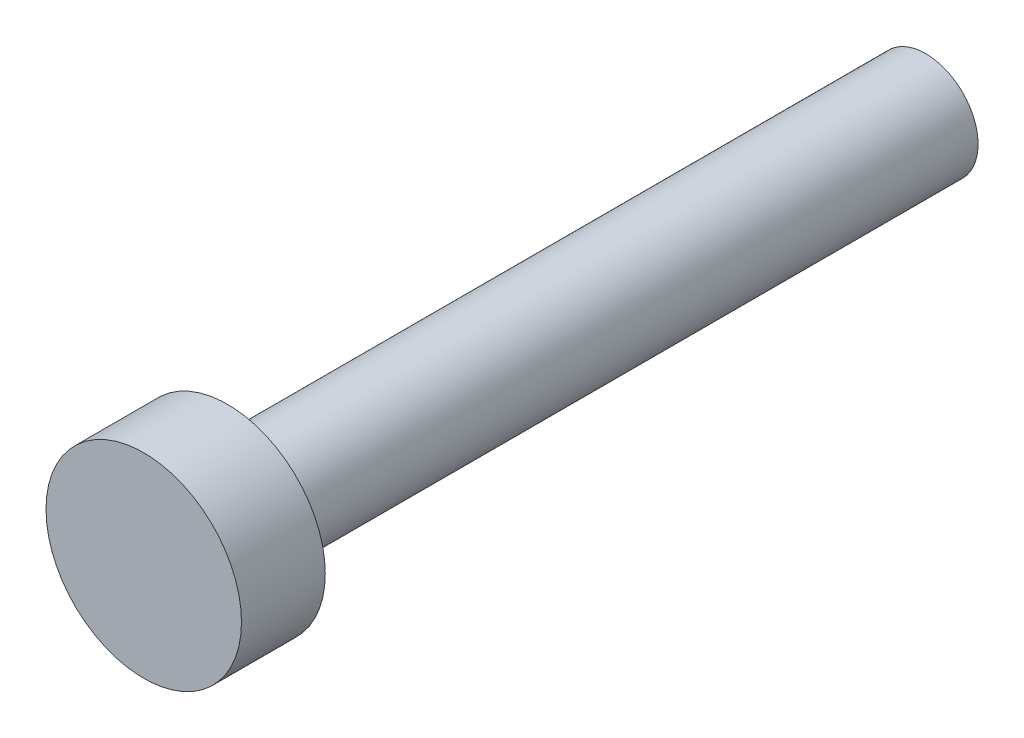
ISO-10303-21;
HEADER;
FILE_DESCRIPTION(('STEP AP214'),'2;1');
FILE_NAME('part.step','',(''),(''),'','','');
FILE_SCHEMA(('AUTOMOTIVE_DESIGN { 1 0 10303 214 1 1 1 1 }'));
ENDSEC;
DATA;
#1=APPLICATION_CONTEXT('core data for automotive mechanical design processes');
#2=APPLICATION_PROTOCOL_DEFINITION('international standard','automotive_design',2000,#1);
#3=PRODUCT_CONTEXT('',#1,'mechanical');
#4=PRODUCT('Part','Part','',(#3));
#5=PRODUCT_RELATED_PRODUCT_CATEGORY('part','',(#4));
#6=PRODUCT_DEFINITION_FORMATION('','',#4);
#7=PRODUCT_DEFINITION_CONTEXT('part definition',#1,'design');
#8=PRODUCT_DEFINITION('design','',#6,#7);
#9=PRODUCT_DEFINITION_SHAPE('','',#8);
#10=(LENGTH_UNIT() NAMED_UNIT(*) SI_UNIT(.MILLI.,.METRE.));
#11=(NAMED_UNIT(*) PLANE_ANGLE_UNIT() SI_UNIT($,.RADIAN.));
#12=(NAMED_UNIT(*) SI_UNIT($,.STERADIAN.) SOLID_ANGLE_UNIT());
#13=UNCERTAINTY_MEASURE_WITH_UNIT(LENGTH_MEASURE(1.E-05),#10,'distance_accuracy_value','');
#14=(GEOMETRIC_REPRESENTATION_CONTEXT(3) GLOBAL_UNCERTAINTY_ASSIGNED_CONTEXT((#13)) GLOBAL_UNIT_ASSIGNED_CONTEXT((#10,
#11,#12)) REPRESENTATION_CONTEXT('',''));
#15=CARTESIAN_POINT('',(0.,0.,0.));
#16=DIRECTION('',(0.,0.,1.));
#17=DIRECTION('',(1.,0.,0.));
#18=AXIS2_PLACEMENT_3D('',#15,#16,#17);
#19=CARTESIAN_POINT('',(0.,0.,2.4));
#20=DIRECTION('',(0.,0.,-1.));
#21=DIRECTION('',(-1.,0.,0.));
#22=AXIS2_PLACEMENT_3D('',#19,#20,#21);
#23=CYLINDRICAL_SURFACE('',#22,2.8);
#24=CARTESIAN_POINT('',(0.,0.,2.4));
#25=DIRECTION('',(0.,0.,1.));
#26=DIRECTION('',(1.,0.,0.));
#27=AXIS2_PLACEMENT_3D('',#24,#25,#26);
#28=CIRCLE('',#27,2.8);
#29=CARTESIAN_POINT('',(2.8,0.,2.4));
#30=VERTEX_POINT('',#29);
#31=EDGE_CURVE('E38',#30,#30,#28,.T.);
#32=ORIENTED_EDGE('',*,*,#31,.F.);
#33=EDGE_LOOP('',(#32));
#34=FACE_BOUND('',#33,.T.);
#35=CARTESIAN_POINT('',(0.,0.,0.));
#36=DIRECTION('',(0.,0.,1.));
#37=DIRECTION('',(1.,0.,0.));
#38=AXIS2_PLACEMENT_3D('',#35,#36,#37);
#39=CIRCLE('',#38,2.8);
#40=CARTESIAN_POINT('',(2.8,0.,0.));
#41=VERTEX_POINT('',#40);
#42=EDGE_CURVE('E34',#41,#41,#39,.T.);
#43=ORIENTED_EDGE('',*,*,#42,.T.);
#44=EDGE_LOOP('',(#43));
#45=FACE_BOUND('',#44,.T.);
#46=ADVANCED_FACE('F31',(#34,#45),#23,.T.);
#47=CARTESIAN_POINT('',(0.,0.,2.4));
#48=DIRECTION('',(0.,0.,1.));
#49=DIRECTION('',(1.,0.,0.));
#50=AXIS2_PLACEMENT_3D('',#47,#48,#49);
#51=PLANE('',#50);
#52=ORIENTED_EDGE('',*,*,#31,.T.);
#53=EDGE_LOOP('',(#52));
#54=FACE_BOUND('',#53,.T.);
#55=ADVANCED_FACE('F55',(#54),#51,.T.);
#56=CARTESIAN_POINT('',(0.,0.,0.));
#57=DIRECTION('',(0.,0.,1.));
#58=DIRECTION('',(1.,0.,0.));
#59=AXIS2_PLACEMENT_3D('',#56,#57,#58);
#60=PLANE('',#59);
#61=CARTESIAN_POINT('',(0.,0.,0.));
#62=DIRECTION('',(0.,0.,-1.));
#63=DIRECTION('',(-1.,0.,0.));
#64=AXIS2_PLACEMENT_3D('',#61,#62,#63);
#65=CIRCLE('',#64,1.5);
#66=CARTESIAN_POINT('',(-1.5,0.,0.));
#67=VERTEX_POINT('',#66);
#68=EDGE_CURVE('E10',#67,#67,#65,.T.);
#69=ORIENTED_EDGE('',*,*,#68,.F.);
#70=EDGE_LOOP('',(#69));
#71=FACE_BOUND('',#70,.T.);
#72=ORIENTED_EDGE('',*,*,#42,.F.);
#73=EDGE_LOOP('',(#72));
#74=FACE_BOUND('',#73,.T.);
#75=ADVANCED_FACE('F52',(#71,#74),#60,.F.);
#76=CARTESIAN_POINT('',(0.,0.,-20.));
#77=DIRECTION('',(0.,0.,1.));
#78=DIRECTION('',(1.,0.,0.));
#79=AXIS2_PLACEMENT_3D('',#76,#77,#78);
#80=CYLINDRICAL_SURFACE('',#79,1.5);
#81=CARTESIAN_POINT('',(0.,0.,-20.));
#82=DIRECTION('',(0.,0.,-1.));
#83=DIRECTION('',(-1.,0.,0.));
#84=AXIS2_PLACEMENT_3D('',#81,#82,#83);
#85=CIRCLE('',#84,1.5);
#86=CARTESIAN_POINT('',(-1.5,0.,-20.));
#87=VERTEX_POINT('',#86);
#88=EDGE_CURVE('E44',#87,#87,#85,.T.);
#89=ORIENTED_EDGE('',*,*,#88,.F.);
#90=EDGE_LOOP('',(#89));
#91=FACE_BOUND('',#90,.T.);
#92=ORIENTED_EDGE('',*,*,#68,.T.);
#93=EDGE_LOOP('',(#92));
#94=FACE_BOUND('',#93,.T.);
#95=ADVANCED_FACE('F54',(#91,#94),#80,.T.);
#96=CARTESIAN_POINT('',(0.,0.,-20.));
#97=DIRECTION('',(0.,0.,-1.));
#98=DIRECTION('',(-1.,0.,0.));
#99=AXIS2_PLACEMENT_3D('',#96,#97,#98);
#100=PLANE('',#99);
#101=ORIENTED_EDGE('',*,*,#88,.T.);
#102=EDGE_LOOP('',(#101));
#103=FACE_BOUND('',#102,.T.);
#104=ADVANCED_FACE('F61',(#103),#100,.T.);
#105=CLOSED_SHELL('',(#46,#55,#75,#95,#104));
#106=MANIFOLD_SOLID_BREP('B2',#105);
#107=ADVANCED_BREP_SHAPE_REPRESENTATION('',(#18,#106),#14);
#108=SHAPE_DEFINITION_REPRESENTATION(#9,#107);
ENDSEC;
END-ISO-10303-21;
